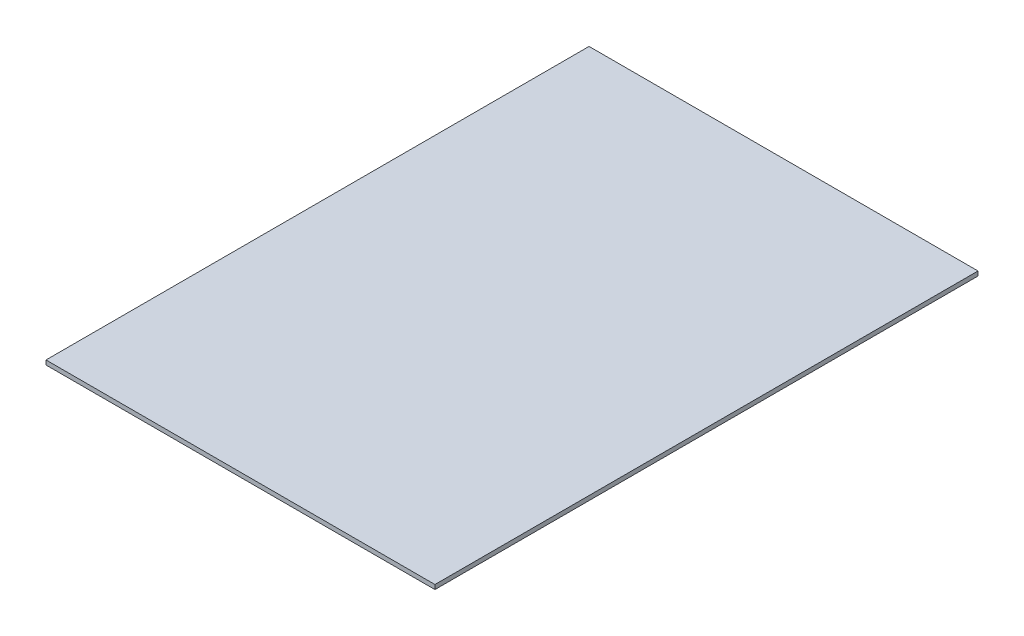
ISO-10303-21;
HEADER;
FILE_DESCRIPTION(('STEP AP214'),'2;1');
FILE_NAME('part.step','',(''),(''),'','','');
FILE_SCHEMA(('AUTOMOTIVE_DESIGN { 1 0 10303 214 1 1 1 1 }'));
ENDSEC;
DATA;
#1=APPLICATION_CONTEXT('core data for automotive mechanical design processes');
#2=APPLICATION_PROTOCOL_DEFINITION('international standard','automotive_design',2000,#1);
#3=PRODUCT_CONTEXT('',#1,'mechanical');
#4=PRODUCT('Part','Part','',(#3));
#5=PRODUCT_RELATED_PRODUCT_CATEGORY('part','',(#4));
#6=PRODUCT_DEFINITION_FORMATION('','',#4);
#7=PRODUCT_DEFINITION_CONTEXT('part definition',#1,'design');
#8=PRODUCT_DEFINITION('design','',#6,#7);
#9=PRODUCT_DEFINITION_SHAPE('','',#8);
#10=(LENGTH_UNIT() NAMED_UNIT(*) SI_UNIT(.MILLI.,.METRE.));
#11=(NAMED_UNIT(*) PLANE_ANGLE_UNIT() SI_UNIT($,.RADIAN.));
#12=(NAMED_UNIT(*) SI_UNIT($,.STERADIAN.) SOLID_ANGLE_UNIT());
#13=UNCERTAINTY_MEASURE_WITH_UNIT(LENGTH_MEASURE(1.E-05),#10,'distance_accuracy_value','');
#14=(GEOMETRIC_REPRESENTATION_CONTEXT(3) GLOBAL_UNCERTAINTY_ASSIGNED_CONTEXT((#13)) GLOBAL_UNIT_ASSIGNED_CONTEXT((#10,
#11,#12)) REPRESENTATION_CONTEXT('',''));
#15=CARTESIAN_POINT('',(0.,0.,0.));
#16=DIRECTION('',(0.,0.,1.));
#17=DIRECTION('',(1.,0.,0.));
#18=AXIS2_PLACEMENT_3D('',#15,#16,#17);
#19=CARTESIAN_POINT('',(0.,4.7625,0.));
#20=DIRECTION('',(1.,0.,0.));
#21=DIRECTION('',(0.,0.,-1.));
#22=AXIS2_PLACEMENT_3D('',#19,#20,#21);
#23=PLANE('',#22);
#24=DIRECTION('',(0.,0.,1.));
#25=VECTOR('',#24,1.);
#26=CARTESIAN_POINT('',(0.,0.,0.));
#27=LINE('',#26,#25);
#28=CARTESIAN_POINT('',(0.,0.,-587.375));
#29=VERTEX_POINT('',#28);
#30=CARTESIAN_POINT('',(0.,0.,0.));
#31=VERTEX_POINT('',#30);
#32=EDGE_CURVE('E96',#29,#31,#27,.T.);
#33=ORIENTED_EDGE('',*,*,#32,.T.);
#34=DIRECTION('',(0.,-1.,0.));
#35=VECTOR('',#34,1.);
#36=CARTESIAN_POINT('',(0.,4.7625,0.));
#37=LINE('',#36,#35);
#38=CARTESIAN_POINT('',(0.,4.7625,0.));
#39=VERTEX_POINT('',#38);
#40=EDGE_CURVE('E11',#39,#31,#37,.T.);
#41=ORIENTED_EDGE('',*,*,#40,.F.);
#42=DIRECTION('',(0.,0.,1.));
#43=VECTOR('',#42,1.);
#44=CARTESIAN_POINT('',(0.,4.7625,0.));
#45=LINE('',#44,#43);
#46=CARTESIAN_POINT('',(0.,4.7625,-587.375));
#47=VERTEX_POINT('',#46);
#48=EDGE_CURVE('E84',#47,#39,#45,.T.);
#49=ORIENTED_EDGE('',*,*,#48,.F.);
#50=DIRECTION('',(0.,-1.,0.));
#51=VECTOR('',#50,1.);
#52=CARTESIAN_POINT('',(0.,4.7625,-587.375));
#53=LINE('',#52,#51);
#54=EDGE_CURVE('E92',#47,#29,#53,.T.);
#55=ORIENTED_EDGE('',*,*,#54,.T.);
#56=EDGE_LOOP('',(#33,#41,#49,#55));
#57=FACE_BOUND('',#56,.T.);
#58=ADVANCED_FACE('F33',(#57),#23,.F.);
#59=CARTESIAN_POINT('',(0.,4.7625,0.));
#60=DIRECTION('',(0.,0.,-1.));
#61=DIRECTION('',(-1.,0.,0.));
#62=AXIS2_PLACEMENT_3D('',#59,#60,#61);
#63=PLANE('',#62);
#64=DIRECTION('',(1.,0.,0.));
#65=VECTOR('',#64,1.);
#66=CARTESIAN_POINT('',(0.,0.,0.));
#67=LINE('',#66,#65);
#68=CARTESIAN_POINT('',(420.6875,0.,0.));
#69=VERTEX_POINT('',#68);
#70=EDGE_CURVE('E88',#31,#69,#67,.T.);
#71=ORIENTED_EDGE('',*,*,#70,.T.);
#72=DIRECTION('',(0.,-1.,0.));
#73=VECTOR('',#72,1.);
#74=CARTESIAN_POINT('',(420.6875,4.7625,0.));
#75=LINE('',#74,#73);
#76=CARTESIAN_POINT('',(420.6875,4.7625,0.));
#77=VERTEX_POINT('',#76);
#78=EDGE_CURVE('E41',#77,#69,#75,.T.);
#79=ORIENTED_EDGE('',*,*,#78,.F.);
#80=DIRECTION('',(1.,0.,0.));
#81=VECTOR('',#80,1.);
#82=CARTESIAN_POINT('',(0.,4.7625,0.));
#83=LINE('',#82,#81);
#84=EDGE_CURVE('E79',#39,#77,#83,.T.);
#85=ORIENTED_EDGE('',*,*,#84,.F.);
#86=ORIENTED_EDGE('',*,*,#40,.T.);
#87=EDGE_LOOP('',(#71,#79,#85,#86));
#88=FACE_BOUND('',#87,.T.);
#89=ADVANCED_FACE('F87',(#88),#63,.F.);
#90=CARTESIAN_POINT('',(420.6875,4.7625,0.));
#91=DIRECTION('',(-1.,0.,0.));
#92=DIRECTION('',(0.,0.,1.));
#93=AXIS2_PLACEMENT_3D('',#90,#91,#92);
#94=PLANE('',#93);
#95=DIRECTION('',(0.,0.,-1.));
#96=VECTOR('',#95,1.);
#97=CARTESIAN_POINT('',(420.6875,0.,0.));
#98=LINE('',#97,#96);
#99=CARTESIAN_POINT('',(420.6875,0.,-587.375));
#100=VERTEX_POINT('',#99);
#101=EDGE_CURVE('E66',#69,#100,#98,.T.);
#102=ORIENTED_EDGE('',*,*,#101,.T.);
#103=DIRECTION('',(0.,-1.,0.));
#104=VECTOR('',#103,1.);
#105=CARTESIAN_POINT('',(420.6875,4.7625,-587.375));
#106=LINE('',#105,#104);
#107=CARTESIAN_POINT('',(420.6875,4.7625,-587.375));
#108=VERTEX_POINT('',#107);
#109=EDGE_CURVE('E89',#108,#100,#106,.T.);
#110=ORIENTED_EDGE('',*,*,#109,.F.);
#111=DIRECTION('',(0.,0.,-1.));
#112=VECTOR('',#111,1.);
#113=CARTESIAN_POINT('',(420.6875,4.7625,0.));
#114=LINE('',#113,#112);
#115=EDGE_CURVE('E82',#77,#108,#114,.T.);
#116=ORIENTED_EDGE('',*,*,#115,.F.);
#117=ORIENTED_EDGE('',*,*,#78,.T.);
#118=EDGE_LOOP('',(#102,#110,#116,#117));
#119=FACE_BOUND('',#118,.T.);
#120=ADVANCED_FACE('F90',(#119),#94,.F.);
#121=CARTESIAN_POINT('',(0.,4.7625,-587.375));
#122=DIRECTION('',(0.,0.,1.));
#123=DIRECTION('',(1.,0.,0.));
#124=AXIS2_PLACEMENT_3D('',#121,#122,#123);
#125=PLANE('',#124);
#126=DIRECTION('',(-1.,0.,0.));
#127=VECTOR('',#126,1.);
#128=CARTESIAN_POINT('',(0.,0.,-587.375));
#129=LINE('',#128,#127);
#130=EDGE_CURVE('E72',#100,#29,#129,.T.);
#131=ORIENTED_EDGE('',*,*,#130,.T.);
#132=ORIENTED_EDGE('',*,*,#54,.F.);
#133=DIRECTION('',(-1.,0.,0.));
#134=VECTOR('',#133,1.);
#135=CARTESIAN_POINT('',(0.,4.7625,-587.375));
#136=LINE('',#135,#134);
#137=EDGE_CURVE('E49',#108,#47,#136,.T.);
#138=ORIENTED_EDGE('',*,*,#137,.F.);
#139=ORIENTED_EDGE('',*,*,#109,.T.);
#140=EDGE_LOOP('',(#131,#132,#138,#139));
#141=FACE_BOUND('',#140,.T.);
#142=ADVANCED_FACE('F103',(#141),#125,.F.);
#143=CARTESIAN_POINT('',(0.,4.7625,0.));
#144=DIRECTION('',(0.,-1.,0.));
#145=DIRECTION('',(0.,0.,-1.));
#146=AXIS2_PLACEMENT_3D('',#143,#144,#145);
#147=PLANE('',#146);
#148=ORIENTED_EDGE('',*,*,#48,.T.);
#149=ORIENTED_EDGE('',*,*,#84,.T.);
#150=ORIENTED_EDGE('',*,*,#115,.T.);
#151=ORIENTED_EDGE('',*,*,#137,.T.);
#152=EDGE_LOOP('',(#148,#149,#150,#151));
#153=FACE_BOUND('',#152,.T.);
#154=ADVANCED_FACE('F80',(#153),#147,.F.);
#155=CARTESIAN_POINT('',(0.,0.,0.));
#156=DIRECTION('',(0.,-1.,0.));
#157=DIRECTION('',(0.,0.,-1.));
#158=AXIS2_PLACEMENT_3D('',#155,#156,#157);
#159=PLANE('',#158);
#160=ORIENTED_EDGE('',*,*,#32,.F.);
#161=ORIENTED_EDGE('',*,*,#130,.F.);
#162=ORIENTED_EDGE('',*,*,#101,.F.);
#163=ORIENTED_EDGE('',*,*,#70,.F.);
#164=EDGE_LOOP('',(#160,#161,#162,#163));
#165=FACE_BOUND('',#164,.T.);
#166=ADVANCED_FACE('F106',(#165),#159,.T.);
#167=CLOSED_SHELL('',(#58,#89,#120,#142,#154,#166));
#168=MANIFOLD_SOLID_BREP('B2',#167);
#169=ADVANCED_BREP_SHAPE_REPRESENTATION('',(#18,#168),#14);
#170=SHAPE_DEFINITION_REPRESENTATION(#9,#169);
ENDSEC;
END-ISO-10303-21;
